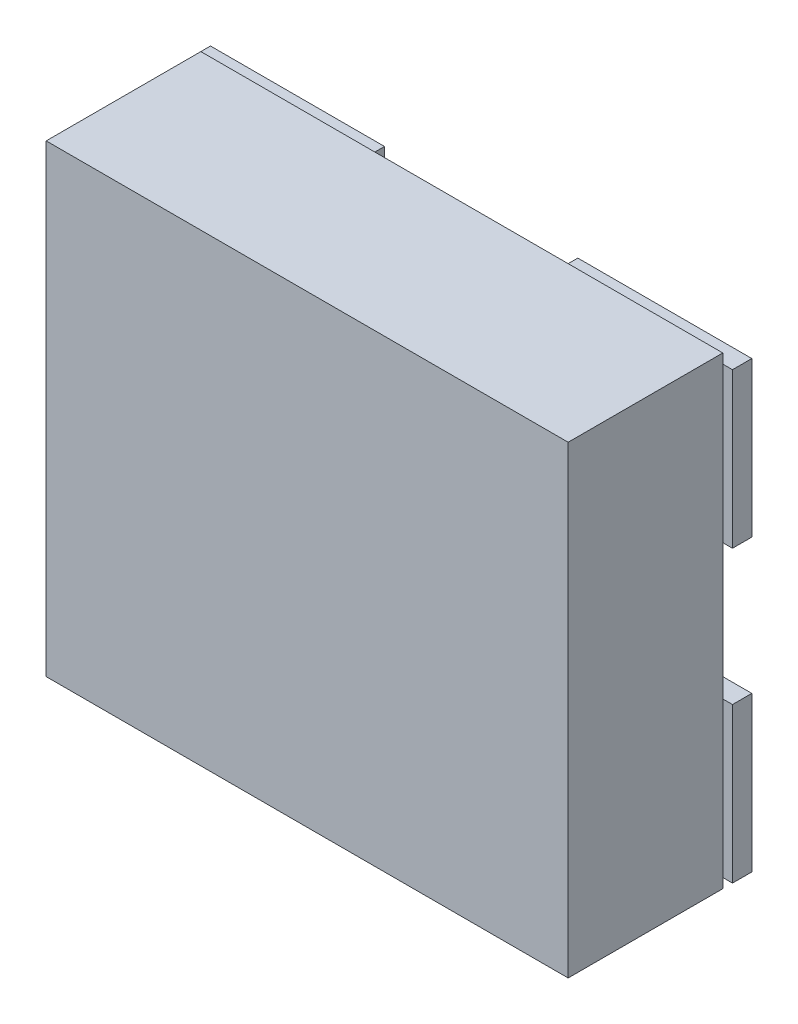
ISO-10303-21;
HEADER;
FILE_DESCRIPTION(('STEP AP214'),'2;1');
FILE_NAME('part.step','',(''),(''),'','','');
FILE_SCHEMA(('AUTOMOTIVE_DESIGN { 1 0 10303 214 1 1 1 1 }'));
ENDSEC;
DATA;
#1=APPLICATION_CONTEXT('core data for automotive mechanical design processes');
#2=APPLICATION_PROTOCOL_DEFINITION('international standard','automotive_design',2000,#1);
#3=PRODUCT_CONTEXT('',#1,'mechanical');
#4=PRODUCT('Part','Part','',(#3));
#5=PRODUCT_RELATED_PRODUCT_CATEGORY('part','',(#4));
#6=PRODUCT_DEFINITION_FORMATION('','',#4);
#7=PRODUCT_DEFINITION_CONTEXT('part definition',#1,'design');
#8=PRODUCT_DEFINITION('design','',#6,#7);
#9=PRODUCT_DEFINITION_SHAPE('','',#8);
#10=(LENGTH_UNIT() NAMED_UNIT(*) SI_UNIT(.MILLI.,.METRE.));
#11=(NAMED_UNIT(*) PLANE_ANGLE_UNIT() SI_UNIT($,.RADIAN.));
#12=(NAMED_UNIT(*) SI_UNIT($,.STERADIAN.) SOLID_ANGLE_UNIT());
#13=UNCERTAINTY_MEASURE_WITH_UNIT(LENGTH_MEASURE(1.E-05),#10,'distance_accuracy_value','');
#14=(GEOMETRIC_REPRESENTATION_CONTEXT(3) GLOBAL_UNCERTAINTY_ASSIGNED_CONTEXT((#13)) GLOBAL_UNIT_ASSIGNED_CONTEXT((#10,
#11,#12)) REPRESENTATION_CONTEXT('',''));
#15=CARTESIAN_POINT('',(0.,0.,0.));
#16=DIRECTION('',(0.,0.,1.));
#17=DIRECTION('',(1.,0.,0.));
#18=AXIS2_PLACEMENT_3D('',#15,#16,#17);
#19=CARTESIAN_POINT('',(0.,0.,0.9));
#20=DIRECTION('',(0.,0.,-1.));
#21=DIRECTION('',(0.,-1.,0.));
#22=AXIS2_PLACEMENT_3D('',#19,#20,#21);
#23=PLANE('',#22);
#24=DIRECTION('',(0.,1.,0.));
#25=VECTOR('',#24,1.);
#26=CARTESIAN_POINT('',(-1.35,-1.2,0.9));
#27=LINE('',#26,#25);
#28=CARTESIAN_POINT('',(-1.35,-1.2,0.9));
#29=VERTEX_POINT('',#28);
#30=CARTESIAN_POINT('',(-1.35,1.2,0.9));
#31=VERTEX_POINT('',#30);
#32=EDGE_CURVE('P0_E25',#29,#31,#27,.T.);
#33=ORIENTED_EDGE('',*,*,#32,.F.);
#34=DIRECTION('',(-1.,0.,0.));
#35=VECTOR('',#34,1.);
#36=CARTESIAN_POINT('',(1.35,-1.2,0.9));
#37=LINE('',#36,#35);
#38=CARTESIAN_POINT('',(1.35,-1.2,0.9));
#39=VERTEX_POINT('',#38);
#40=EDGE_CURVE('P0_E66',#39,#29,#37,.T.);
#41=ORIENTED_EDGE('',*,*,#40,.F.);
#42=DIRECTION('',(0.,-1.,0.));
#43=VECTOR('',#42,1.);
#44=CARTESIAN_POINT('',(1.35,1.2,0.9));
#45=LINE('',#44,#43);
#46=CARTESIAN_POINT('',(1.35,1.2,0.9));
#47=VERTEX_POINT('',#46);
#48=EDGE_CURVE('P0_E69',#47,#39,#45,.T.);
#49=ORIENTED_EDGE('',*,*,#48,.F.);
#50=DIRECTION('',(1.,0.,0.));
#51=VECTOR('',#50,1.);
#52=CARTESIAN_POINT('',(-1.35,1.2,0.9));
#53=LINE('',#52,#51);
#54=EDGE_CURVE('P0_E111',#31,#47,#53,.T.);
#55=ORIENTED_EDGE('',*,*,#54,.F.);
#56=EDGE_LOOP('',(#33,#41,#49,#55));
#57=FACE_BOUND('',#56,.T.);
#58=ADVANCED_FACE('P0_F17',(#57),#23,.F.);
#59=CARTESIAN_POINT('',(0.,0.,0.1));
#60=DIRECTION('',(0.,0.,-1.));
#61=DIRECTION('',(0.,-1.,0.));
#62=AXIS2_PLACEMENT_3D('',#59,#60,#61);
#63=PLANE('',#62);
#64=DIRECTION('',(1.,0.,0.));
#65=VECTOR('',#64,1.);
#66=CARTESIAN_POINT('',(-1.35,1.2,0.1));
#67=LINE('',#66,#65);
#68=CARTESIAN_POINT('',(-1.35,1.2,0.1));
#69=VERTEX_POINT('',#68);
#70=CARTESIAN_POINT('',(1.35,1.2,0.1));
#71=VERTEX_POINT('',#70);
#72=EDGE_CURVE('P0_E90',#69,#71,#67,.T.);
#73=ORIENTED_EDGE('',*,*,#72,.T.);
#74=DIRECTION('',(0.,-1.,0.));
#75=VECTOR('',#74,1.);
#76=CARTESIAN_POINT('',(1.35,1.2,0.1));
#77=LINE('',#76,#75);
#78=CARTESIAN_POINT('',(1.35,-1.2,0.1));
#79=VERTEX_POINT('',#78);
#80=EDGE_CURVE('P0_E75',#71,#79,#77,.T.);
#81=ORIENTED_EDGE('',*,*,#80,.T.);
#82=DIRECTION('',(-1.,0.,0.));
#83=VECTOR('',#82,1.);
#84=CARTESIAN_POINT('',(1.35,-1.2,0.1));
#85=LINE('',#84,#83);
#86=CARTESIAN_POINT('',(-1.35,-1.2,0.1));
#87=VERTEX_POINT('',#86);
#88=EDGE_CURVE('P0_E80',#79,#87,#85,.T.);
#89=ORIENTED_EDGE('',*,*,#88,.T.);
#90=DIRECTION('',(0.,1.,0.));
#91=VECTOR('',#90,1.);
#92=CARTESIAN_POINT('',(-1.35,-1.2,0.1));
#93=LINE('',#92,#91);
#94=EDGE_CURVE('P0_E11',#87,#69,#93,.T.);
#95=ORIENTED_EDGE('',*,*,#94,.T.);
#96=EDGE_LOOP('',(#73,#81,#89,#95));
#97=FACE_BOUND('',#96,.T.);
#98=ADVANCED_FACE('P0_F157',(#97),#63,.T.);
#99=CARTESIAN_POINT('',(-1.35,-1.2,0.1));
#100=DIRECTION('',(-1.,0.,0.));
#101=DIRECTION('',(0.,0.,1.));
#102=AXIS2_PLACEMENT_3D('',#99,#100,#101);
#103=PLANE('',#102);
#104=DIRECTION('',(0.,0.,1.));
#105=VECTOR('',#104,1.);
#106=CARTESIAN_POINT('',(-1.35,-1.2,0.1));
#107=LINE('',#106,#105);
#108=EDGE_CURVE('P0_E74',#87,#29,#107,.T.);
#109=ORIENTED_EDGE('',*,*,#108,.T.);
#110=ORIENTED_EDGE('',*,*,#32,.T.);
#111=DIRECTION('',(0.,0.,1.));
#112=VECTOR('',#111,1.);
#113=CARTESIAN_POINT('',(-1.35,1.2,0.1));
#114=LINE('',#113,#112);
#115=EDGE_CURVE('P0_E110',#69,#31,#114,.T.);
#116=ORIENTED_EDGE('',*,*,#115,.F.);
#117=ORIENTED_EDGE('',*,*,#94,.F.);
#118=EDGE_LOOP('',(#109,#110,#116,#117));
#119=FACE_BOUND('',#118,.T.);
#120=ADVANCED_FACE('P0_F108',(#119),#103,.T.);
#121=CARTESIAN_POINT('',(1.35,-1.2,0.1));
#122=DIRECTION('',(0.,-1.,0.));
#123=DIRECTION('',(0.,0.,-1.));
#124=AXIS2_PLACEMENT_3D('',#121,#122,#123);
#125=PLANE('',#124);
#126=DIRECTION('',(0.,0.,1.));
#127=VECTOR('',#126,1.);
#128=CARTESIAN_POINT('',(1.35,-1.2,0.1));
#129=LINE('',#128,#127);
#130=EDGE_CURVE('P0_E78',#79,#39,#129,.T.);
#131=ORIENTED_EDGE('',*,*,#130,.T.);
#132=ORIENTED_EDGE('',*,*,#40,.T.);
#133=ORIENTED_EDGE('',*,*,#108,.F.);
#134=ORIENTED_EDGE('',*,*,#88,.F.);
#135=EDGE_LOOP('',(#131,#132,#133,#134));
#136=FACE_BOUND('',#135,.T.);
#137=ADVANCED_FACE('P0_F79',(#136),#125,.T.);
#138=CARTESIAN_POINT('',(1.35,1.2,0.1));
#139=DIRECTION('',(1.,0.,0.));
#140=DIRECTION('',(0.,1.,0.));
#141=AXIS2_PLACEMENT_3D('',#138,#139,#140);
#142=PLANE('',#141);
#143=DIRECTION('',(0.,0.,1.));
#144=VECTOR('',#143,1.);
#145=CARTESIAN_POINT('',(1.35,1.2,0.1));
#146=LINE('',#145,#144);
#147=EDGE_CURVE('P0_E87',#71,#47,#146,.T.);
#148=ORIENTED_EDGE('',*,*,#147,.T.);
#149=ORIENTED_EDGE('',*,*,#48,.T.);
#150=ORIENTED_EDGE('',*,*,#130,.F.);
#151=ORIENTED_EDGE('',*,*,#80,.F.);
#152=EDGE_LOOP('',(#148,#149,#150,#151));
#153=FACE_BOUND('',#152,.T.);
#154=ADVANCED_FACE('P0_F85',(#153),#142,.T.);
#155=CARTESIAN_POINT('',(-1.35,1.2,0.1));
#156=DIRECTION('',(0.,1.,0.));
#157=DIRECTION('',(1.,0.,0.));
#158=AXIS2_PLACEMENT_3D('',#155,#156,#157);
#159=PLANE('',#158);
#160=ORIENTED_EDGE('',*,*,#115,.T.);
#161=ORIENTED_EDGE('',*,*,#54,.T.);
#162=ORIENTED_EDGE('',*,*,#147,.F.);
#163=ORIENTED_EDGE('',*,*,#72,.F.);
#164=EDGE_LOOP('',(#160,#161,#162,#163));
#165=FACE_BOUND('',#164,.T.);
#166=ADVANCED_FACE('P0_F116',(#165),#159,.T.);
#167=CLOSED_SHELL('',(#58,#98,#120,#137,#154,#166));
#168=MANIFOLD_SOLID_BREP('P0_B1',#167);
#169=CARTESIAN_POINT('',(-1.4,-1.15,0.1));
#170=DIRECTION('',(0.,0.,1.));
#171=DIRECTION('',(1.,0.,0.));
#172=AXIS2_PLACEMENT_3D('',#169,#170,#171);
#173=PLANE('',#172);
#174=DIRECTION('',(0.,1.,0.));
#175=VECTOR('',#174,1.);
#176=CARTESIAN_POINT('',(-1.4,-1.15,0.1));
#177=LINE('',#176,#175);
#178=CARTESIAN_POINT('',(-1.4,-1.15,0.1));
#179=VERTEX_POINT('',#178);
#180=CARTESIAN_POINT('',(-1.4,-0.35,0.1));
#181=VERTEX_POINT('',#180);
#182=EDGE_CURVE('P1_E87',#179,#181,#177,.T.);
#183=ORIENTED_EDGE('',*,*,#182,.F.);
#184=DIRECTION('',(1.,0.,0.));
#185=VECTOR('',#184,1.);
#186=CARTESIAN_POINT('',(-1.4,-1.15,0.1));
#187=LINE('',#186,#185);
#188=CARTESIAN_POINT('',(-0.5,-1.15,0.1));
#189=VERTEX_POINT('',#188);
#190=EDGE_CURVE('P1_E70',#179,#189,#187,.T.);
#191=ORIENTED_EDGE('',*,*,#190,.T.);
#192=DIRECTION('',(0.,1.,0.));
#193=VECTOR('',#192,1.);
#194=CARTESIAN_POINT('',(-0.5,-1.15,0.1));
#195=LINE('',#194,#193);
#196=CARTESIAN_POINT('',(-0.5,-0.35,0.1));
#197=VERTEX_POINT('',#196);
#198=EDGE_CURVE('P1_E82',#189,#197,#195,.T.);
#199=ORIENTED_EDGE('',*,*,#198,.T.);
#200=DIRECTION('',(1.,0.,0.));
#201=VECTOR('',#200,1.);
#202=CARTESIAN_POINT('',(-1.4,-0.35,0.1));
#203=LINE('',#202,#201);
#204=EDGE_CURVE('P1_E11',#181,#197,#203,.T.);
#205=ORIENTED_EDGE('',*,*,#204,.F.);
#206=EDGE_LOOP('',(#183,#191,#199,#205));
#207=FACE_BOUND('',#206,.T.);
#208=ADVANCED_FACE('P1_F17',(#207),#173,.T.);
#209=CARTESIAN_POINT('',(-1.4,-1.15,0.));
#210=DIRECTION('',(0.,0.,1.));
#211=DIRECTION('',(1.,0.,0.));
#212=AXIS2_PLACEMENT_3D('',#209,#210,#211);
#213=PLANE('',#212);
#214=DIRECTION('',(1.,0.,0.));
#215=VECTOR('',#214,1.);
#216=CARTESIAN_POINT('',(-1.4,-0.35,0.));
#217=LINE('',#216,#215);
#218=CARTESIAN_POINT('',(-1.4,-0.35,0.));
#219=VERTEX_POINT('',#218);
#220=CARTESIAN_POINT('',(-0.5,-0.35,0.));
#221=VERTEX_POINT('',#220);
#222=EDGE_CURVE('P1_E25',#219,#221,#217,.T.);
#223=ORIENTED_EDGE('',*,*,#222,.T.);
#224=DIRECTION('',(0.,1.,0.));
#225=VECTOR('',#224,1.);
#226=CARTESIAN_POINT('',(-0.5,-1.15,0.));
#227=LINE('',#226,#225);
#228=CARTESIAN_POINT('',(-0.5,-1.15,0.));
#229=VERTEX_POINT('',#228);
#230=EDGE_CURVE('P1_E104',#229,#221,#227,.T.);
#231=ORIENTED_EDGE('',*,*,#230,.F.);
#232=DIRECTION('',(1.,0.,0.));
#233=VECTOR('',#232,1.);
#234=CARTESIAN_POINT('',(-1.4,-1.15,0.));
#235=LINE('',#234,#233);
#236=CARTESIAN_POINT('',(-1.4,-1.15,0.));
#237=VERTEX_POINT('',#236);
#238=EDGE_CURVE('P1_E81',#237,#229,#235,.T.);
#239=ORIENTED_EDGE('',*,*,#238,.F.);
#240=DIRECTION('',(0.,1.,0.));
#241=VECTOR('',#240,1.);
#242=CARTESIAN_POINT('',(-1.4,-1.15,0.));
#243=LINE('',#242,#241);
#244=EDGE_CURVE('P1_E88',#237,#219,#243,.T.);
#245=ORIENTED_EDGE('',*,*,#244,.T.);
#246=EDGE_LOOP('',(#223,#231,#239,#245));
#247=FACE_BOUND('',#246,.T.);
#248=ADVANCED_FACE('P1_F119',(#247),#213,.F.);
#249=CARTESIAN_POINT('',(-1.4,-0.35,0.));
#250=DIRECTION('',(0.,1.,0.));
#251=DIRECTION('',(1.,0.,0.));
#252=AXIS2_PLACEMENT_3D('',#249,#250,#251);
#253=PLANE('',#252);
#254=ORIENTED_EDGE('',*,*,#222,.F.);
#255=DIRECTION('',(0.,0.,1.));
#256=VECTOR('',#255,1.);
#257=CARTESIAN_POINT('',(-1.4,-0.35,0.));
#258=LINE('',#257,#256);
#259=EDGE_CURVE('P1_E92',#219,#181,#258,.T.);
#260=ORIENTED_EDGE('',*,*,#259,.T.);
#261=ORIENTED_EDGE('',*,*,#204,.T.);
#262=DIRECTION('',(0.,0.,1.));
#263=VECTOR('',#262,1.);
#264=CARTESIAN_POINT('',(-0.5,-0.35,0.));
#265=LINE('',#264,#263);
#266=EDGE_CURVE('P1_E100',#221,#197,#265,.T.);
#267=ORIENTED_EDGE('',*,*,#266,.F.);
#268=EDGE_LOOP('',(#254,#260,#261,#267));
#269=FACE_BOUND('',#268,.T.);
#270=ADVANCED_FACE('P1_F118',(#269),#253,.T.);
#271=CARTESIAN_POINT('',(-1.4,-1.15,0.));
#272=DIRECTION('',(0.,1.,0.));
#273=DIRECTION('',(1.,0.,0.));
#274=AXIS2_PLACEMENT_3D('',#271,#272,#273);
#275=PLANE('',#274);
#276=DIRECTION('',(0.,0.,1.));
#277=VECTOR('',#276,1.);
#278=CARTESIAN_POINT('',(-0.5,-1.15,0.));
#279=LINE('',#278,#277);
#280=EDGE_CURVE('P1_E76',#229,#189,#279,.T.);
#281=ORIENTED_EDGE('',*,*,#280,.T.);
#282=ORIENTED_EDGE('',*,*,#190,.F.);
#283=DIRECTION('',(0.,0.,1.));
#284=VECTOR('',#283,1.);
#285=CARTESIAN_POINT('',(-1.4,-1.15,0.));
#286=LINE('',#285,#284);
#287=EDGE_CURVE('P1_E73',#237,#179,#286,.T.);
#288=ORIENTED_EDGE('',*,*,#287,.F.);
#289=ORIENTED_EDGE('',*,*,#238,.T.);
#290=EDGE_LOOP('',(#281,#282,#288,#289));
#291=FACE_BOUND('',#290,.T.);
#292=ADVANCED_FACE('P1_F72',(#291),#275,.F.);
#293=CARTESIAN_POINT('',(-0.5,-1.15,0.));
#294=DIRECTION('',(1.,0.,0.));
#295=DIRECTION('',(0.,1.,0.));
#296=AXIS2_PLACEMENT_3D('',#293,#294,#295);
#297=PLANE('',#296);
#298=ORIENTED_EDGE('',*,*,#280,.F.);
#299=ORIENTED_EDGE('',*,*,#230,.T.);
#300=ORIENTED_EDGE('',*,*,#266,.T.);
#301=ORIENTED_EDGE('',*,*,#198,.F.);
#302=EDGE_LOOP('',(#298,#299,#300,#301));
#303=FACE_BOUND('',#302,.T.);
#304=ADVANCED_FACE('P1_F117',(#303),#297,.T.);
#305=CARTESIAN_POINT('',(-1.4,-1.15,0.));
#306=DIRECTION('',(1.,0.,0.));
#307=DIRECTION('',(0.,1.,0.));
#308=AXIS2_PLACEMENT_3D('',#305,#306,#307);
#309=PLANE('',#308);
#310=ORIENTED_EDGE('',*,*,#182,.T.);
#311=ORIENTED_EDGE('',*,*,#259,.F.);
#312=ORIENTED_EDGE('',*,*,#244,.F.);
#313=ORIENTED_EDGE('',*,*,#287,.T.);
#314=EDGE_LOOP('',(#310,#311,#312,#313));
#315=FACE_BOUND('',#314,.T.);
#316=ADVANCED_FACE('P1_F85',(#315),#309,.F.);
#317=CLOSED_SHELL('',(#208,#248,#270,#292,#304,#316));
#318=MANIFOLD_SOLID_BREP('P1_B1',#317);
#319=CARTESIAN_POINT('',(0.5,-1.15,0.1));
#320=DIRECTION('',(0.,0.,1.));
#321=DIRECTION('',(1.,0.,0.));
#322=AXIS2_PLACEMENT_3D('',#319,#320,#321);
#323=PLANE('',#322);
#324=DIRECTION('',(0.,1.,0.));
#325=VECTOR('',#324,1.);
#326=CARTESIAN_POINT('',(0.5,-1.15,0.1));
#327=LINE('',#326,#325);
#328=CARTESIAN_POINT('',(0.5,-1.15,0.1));
#329=VERTEX_POINT('',#328);
#330=CARTESIAN_POINT('',(0.5,-0.35,0.1));
#331=VERTEX_POINT('',#330);
#332=EDGE_CURVE('P2_E114',#329,#331,#327,.T.);
#333=ORIENTED_EDGE('',*,*,#332,.F.);
#334=DIRECTION('',(1.,0.,0.));
#335=VECTOR('',#334,1.);
#336=CARTESIAN_POINT('',(0.5,-1.15,0.1));
#337=LINE('',#336,#335);
#338=CARTESIAN_POINT('',(1.4,-1.15,0.1));
#339=VERTEX_POINT('',#338);
#340=EDGE_CURVE('P2_E78',#329,#339,#337,.T.);
#341=ORIENTED_EDGE('',*,*,#340,.T.);
#342=DIRECTION('',(0.,1.,0.));
#343=VECTOR('',#342,1.);
#344=CARTESIAN_POINT('',(1.4,-1.15,0.1));
#345=LINE('',#344,#343);
#346=CARTESIAN_POINT('',(1.4,-0.35,0.1));
#347=VERTEX_POINT('',#346);
#348=EDGE_CURVE('P2_E89',#339,#347,#345,.T.);
#349=ORIENTED_EDGE('',*,*,#348,.T.);
#350=DIRECTION('',(1.,0.,0.));
#351=VECTOR('',#350,1.);
#352=CARTESIAN_POINT('',(0.5,-0.35,0.1));
#353=LINE('',#352,#351);
#354=EDGE_CURVE('P2_E11',#331,#347,#353,.T.);
#355=ORIENTED_EDGE('',*,*,#354,.F.);
#356=EDGE_LOOP('',(#333,#341,#349,#355));
#357=FACE_BOUND('',#356,.T.);
#358=ADVANCED_FACE('P2_F17',(#357),#323,.T.);
#359=CARTESIAN_POINT('',(0.5,-1.15,0.));
#360=DIRECTION('',(0.,0.,1.));
#361=DIRECTION('',(1.,0.,0.));
#362=AXIS2_PLACEMENT_3D('',#359,#360,#361);
#363=PLANE('',#362);
#364=DIRECTION('',(1.,0.,0.));
#365=VECTOR('',#364,1.);
#366=CARTESIAN_POINT('',(0.5,-0.35,0.));
#367=LINE('',#366,#365);
#368=CARTESIAN_POINT('',(0.5,-0.35,0.));
#369=VERTEX_POINT('',#368);
#370=CARTESIAN_POINT('',(1.4,-0.35,0.));
#371=VERTEX_POINT('',#370);
#372=EDGE_CURVE('P2_E25',#369,#371,#367,.T.);
#373=ORIENTED_EDGE('',*,*,#372,.T.);
#374=DIRECTION('',(0.,1.,0.));
#375=VECTOR('',#374,1.);
#376=CARTESIAN_POINT('',(1.4,-1.15,0.));
#377=LINE('',#376,#375);
#378=CARTESIAN_POINT('',(1.4,-1.15,0.));
#379=VERTEX_POINT('',#378);
#380=EDGE_CURVE('P2_E80',#379,#371,#377,.T.);
#381=ORIENTED_EDGE('',*,*,#380,.F.);
#382=DIRECTION('',(1.,0.,0.));
#383=VECTOR('',#382,1.);
#384=CARTESIAN_POINT('',(0.5,-1.15,0.));
#385=LINE('',#384,#383);
#386=CARTESIAN_POINT('',(0.5,-1.15,0.));
#387=VERTEX_POINT('',#386);
#388=EDGE_CURVE('P2_E70',#387,#379,#385,.T.);
#389=ORIENTED_EDGE('',*,*,#388,.F.);
#390=DIRECTION('',(0.,1.,0.));
#391=VECTOR('',#390,1.);
#392=CARTESIAN_POINT('',(0.5,-1.15,0.));
#393=LINE('',#392,#391);
#394=EDGE_CURVE('P2_E96',#387,#369,#393,.T.);
#395=ORIENTED_EDGE('',*,*,#394,.T.);
#396=EDGE_LOOP('',(#373,#381,#389,#395));
#397=FACE_BOUND('',#396,.T.);
#398=ADVANCED_FACE('P2_F81',(#397),#363,.F.);
#399=CARTESIAN_POINT('',(0.5,-0.35,0.));
#400=DIRECTION('',(0.,1.,0.));
#401=DIRECTION('',(1.,0.,0.));
#402=AXIS2_PLACEMENT_3D('',#399,#400,#401);
#403=PLANE('',#402);
#404=ORIENTED_EDGE('',*,*,#372,.F.);
#405=DIRECTION('',(0.,0.,1.));
#406=VECTOR('',#405,1.);
#407=CARTESIAN_POINT('',(0.5,-0.35,0.));
#408=LINE('',#407,#406);
#409=EDGE_CURVE('P2_E100',#369,#331,#408,.T.);
#410=ORIENTED_EDGE('',*,*,#409,.T.);
#411=ORIENTED_EDGE('',*,*,#354,.T.);
#412=DIRECTION('',(0.,0.,1.));
#413=VECTOR('',#412,1.);
#414=CARTESIAN_POINT('',(1.4,-0.35,0.));
#415=LINE('',#414,#413);
#416=EDGE_CURVE('P2_E85',#371,#347,#415,.T.);
#417=ORIENTED_EDGE('',*,*,#416,.F.);
#418=EDGE_LOOP('',(#404,#410,#411,#417));
#419=FACE_BOUND('',#418,.T.);
#420=ADVANCED_FACE('P2_F124',(#419),#403,.T.);
#421=CARTESIAN_POINT('',(0.5,-1.15,0.));
#422=DIRECTION('',(0.,1.,0.));
#423=DIRECTION('',(1.,0.,0.));
#424=AXIS2_PLACEMENT_3D('',#421,#422,#423);
#425=PLANE('',#424);
#426=DIRECTION('',(0.,0.,1.));
#427=VECTOR('',#426,1.);
#428=CARTESIAN_POINT('',(1.4,-1.15,0.));
#429=LINE('',#428,#427);
#430=EDGE_CURVE('P2_E73',#379,#339,#429,.T.);
#431=ORIENTED_EDGE('',*,*,#430,.T.);
#432=ORIENTED_EDGE('',*,*,#340,.F.);
#433=DIRECTION('',(0.,0.,1.));
#434=VECTOR('',#433,1.);
#435=CARTESIAN_POINT('',(0.5,-1.15,0.));
#436=LINE('',#435,#434);
#437=EDGE_CURVE('P2_E75',#387,#329,#436,.T.);
#438=ORIENTED_EDGE('',*,*,#437,.F.);
#439=ORIENTED_EDGE('',*,*,#388,.T.);
#440=EDGE_LOOP('',(#431,#432,#438,#439));
#441=FACE_BOUND('',#440,.T.);
#442=ADVANCED_FACE('P2_F71',(#441),#425,.F.);
#443=CARTESIAN_POINT('',(1.4,-1.15,0.));
#444=DIRECTION('',(1.,0.,0.));
#445=DIRECTION('',(0.,1.,0.));
#446=AXIS2_PLACEMENT_3D('',#443,#444,#445);
#447=PLANE('',#446);
#448=ORIENTED_EDGE('',*,*,#430,.F.);
#449=ORIENTED_EDGE('',*,*,#380,.T.);
#450=ORIENTED_EDGE('',*,*,#416,.T.);
#451=ORIENTED_EDGE('',*,*,#348,.F.);
#452=EDGE_LOOP('',(#448,#449,#450,#451));
#453=FACE_BOUND('',#452,.T.);
#454=ADVANCED_FACE('P2_F88',(#453),#447,.T.);
#455=CARTESIAN_POINT('',(0.5,-1.15,0.));
#456=DIRECTION('',(1.,0.,0.));
#457=DIRECTION('',(0.,1.,0.));
#458=AXIS2_PLACEMENT_3D('',#455,#456,#457);
#459=PLANE('',#458);
#460=ORIENTED_EDGE('',*,*,#332,.T.);
#461=ORIENTED_EDGE('',*,*,#409,.F.);
#462=ORIENTED_EDGE('',*,*,#394,.F.);
#463=ORIENTED_EDGE('',*,*,#437,.T.);
#464=EDGE_LOOP('',(#460,#461,#462,#463));
#465=FACE_BOUND('',#464,.T.);
#466=ADVANCED_FACE('P2_F116',(#465),#459,.F.);
#467=CLOSED_SHELL('',(#358,#398,#420,#442,#454,#466));
#468=MANIFOLD_SOLID_BREP('P2_B1',#467);
#469=CARTESIAN_POINT('',(0.5,0.35,0.1));
#470=DIRECTION('',(0.,0.,1.));
#471=DIRECTION('',(1.,0.,0.));
#472=AXIS2_PLACEMENT_3D('',#469,#470,#471);
#473=PLANE('',#472);
#474=DIRECTION('',(0.,1.,0.));
#475=VECTOR('',#474,1.);
#476=CARTESIAN_POINT('',(0.5,0.35,0.1));
#477=LINE('',#476,#475);
#478=CARTESIAN_POINT('',(0.5,0.35,0.1));
#479=VERTEX_POINT('',#478);
#480=CARTESIAN_POINT('',(0.5,1.15,0.1));
#481=VERTEX_POINT('',#480);
#482=EDGE_CURVE('P3_E68',#479,#481,#477,.T.);
#483=ORIENTED_EDGE('',*,*,#482,.F.);
#484=DIRECTION('',(1.,0.,0.));
#485=VECTOR('',#484,1.);
#486=CARTESIAN_POINT('',(0.5,0.35,0.1));
#487=LINE('',#486,#485);
#488=CARTESIAN_POINT('',(1.4,0.35,0.1));
#489=VERTEX_POINT('',#488);
#490=EDGE_CURVE('P3_E63',#479,#489,#487,.T.);
#491=ORIENTED_EDGE('',*,*,#490,.T.);
#492=DIRECTION('',(0.,1.,0.));
#493=VECTOR('',#492,1.);
#494=CARTESIAN_POINT('',(1.4,0.35,0.1));
#495=LINE('',#494,#493);
#496=CARTESIAN_POINT('',(1.4,1.15,0.1));
#497=VERTEX_POINT('',#496);
#498=EDGE_CURVE('P3_E65',#489,#497,#495,.T.);
#499=ORIENTED_EDGE('',*,*,#498,.T.);
#500=DIRECTION('',(1.,0.,0.));
#501=VECTOR('',#500,1.);
#502=CARTESIAN_POINT('',(0.5,1.15,0.1));
#503=LINE('',#502,#501);
#504=EDGE_CURVE('P3_E11',#481,#497,#503,.T.);
#505=ORIENTED_EDGE('',*,*,#504,.F.);
#506=EDGE_LOOP('',(#483,#491,#499,#505));
#507=FACE_BOUND('',#506,.T.);
#508=ADVANCED_FACE('P3_F17',(#507),#473,.T.);
#509=CARTESIAN_POINT('',(0.5,0.35,0.));
#510=DIRECTION('',(0.,0.,1.));
#511=DIRECTION('',(1.,0.,0.));
#512=AXIS2_PLACEMENT_3D('',#509,#510,#511);
#513=PLANE('',#512);
#514=DIRECTION('',(1.,0.,0.));
#515=VECTOR('',#514,1.);
#516=CARTESIAN_POINT('',(0.5,1.15,0.));
#517=LINE('',#516,#515);
#518=CARTESIAN_POINT('',(0.5,1.15,0.));
#519=VERTEX_POINT('',#518);
#520=CARTESIAN_POINT('',(1.4,1.15,0.));
#521=VERTEX_POINT('',#520);
#522=EDGE_CURVE('P3_E26',#519,#521,#517,.T.);
#523=ORIENTED_EDGE('',*,*,#522,.T.);
#524=DIRECTION('',(0.,1.,0.));
#525=VECTOR('',#524,1.);
#526=CARTESIAN_POINT('',(1.4,0.35,0.));
#527=LINE('',#526,#525);
#528=CARTESIAN_POINT('',(1.4,0.35,0.));
#529=VERTEX_POINT('',#528);
#530=EDGE_CURVE('P3_E86',#529,#521,#527,.T.);
#531=ORIENTED_EDGE('',*,*,#530,.F.);
#532=DIRECTION('',(1.,0.,0.));
#533=VECTOR('',#532,1.);
#534=CARTESIAN_POINT('',(0.5,0.35,0.));
#535=LINE('',#534,#533);
#536=CARTESIAN_POINT('',(0.5,0.35,0.));
#537=VERTEX_POINT('',#536);
#538=EDGE_CURVE('P3_E74',#537,#529,#535,.T.);
#539=ORIENTED_EDGE('',*,*,#538,.F.);
#540=DIRECTION('',(0.,1.,0.));
#541=VECTOR('',#540,1.);
#542=CARTESIAN_POINT('',(0.5,0.35,0.));
#543=LINE('',#542,#541);
#544=EDGE_CURVE('P3_E94',#537,#519,#543,.T.);
#545=ORIENTED_EDGE('',*,*,#544,.T.);
#546=EDGE_LOOP('',(#523,#531,#539,#545));
#547=FACE_BOUND('',#546,.T.);
#548=ADVANCED_FACE('P3_F133',(#547),#513,.F.);
#549=CARTESIAN_POINT('',(0.5,1.15,0.));
#550=DIRECTION('',(0.,1.,0.));
#551=DIRECTION('',(1.,0.,0.));
#552=AXIS2_PLACEMENT_3D('',#549,#550,#551);
#553=PLANE('',#552);
#554=ORIENTED_EDGE('',*,*,#522,.F.);
#555=DIRECTION('',(0.,0.,1.));
#556=VECTOR('',#555,1.);
#557=CARTESIAN_POINT('',(0.5,1.15,0.));
#558=LINE('',#557,#556);
#559=EDGE_CURVE('P3_E174',#519,#481,#558,.T.);
#560=ORIENTED_EDGE('',*,*,#559,.T.);
#561=ORIENTED_EDGE('',*,*,#504,.T.);
#562=DIRECTION('',(0.,0.,1.));
#563=VECTOR('',#562,1.);
#564=CARTESIAN_POINT('',(1.4,1.15,0.));
#565=LINE('',#564,#563);
#566=EDGE_CURVE('P3_E80',#521,#497,#565,.T.);
#567=ORIENTED_EDGE('',*,*,#566,.F.);
#568=EDGE_LOOP('',(#554,#560,#561,#567));
#569=FACE_BOUND('',#568,.T.);
#570=ADVANCED_FACE('P3_F126',(#569),#553,.T.);
#571=CARTESIAN_POINT('',(0.5,0.35,0.));
#572=DIRECTION('',(0.,1.,0.));
#573=DIRECTION('',(1.,0.,0.));
#574=AXIS2_PLACEMENT_3D('',#571,#572,#573);
#575=PLANE('',#574);
#576=DIRECTION('',(0.,0.,1.));
#577=VECTOR('',#576,1.);
#578=CARTESIAN_POINT('',(1.4,0.35,0.));
#579=LINE('',#578,#577);
#580=EDGE_CURVE('P3_E79',#529,#489,#579,.T.);
#581=ORIENTED_EDGE('',*,*,#580,.T.);
#582=ORIENTED_EDGE('',*,*,#490,.F.);
#583=DIRECTION('',(0.,0.,1.));
#584=VECTOR('',#583,1.);
#585=CARTESIAN_POINT('',(0.5,0.35,0.));
#586=LINE('',#585,#584);
#587=EDGE_CURVE('P3_E87',#537,#479,#586,.T.);
#588=ORIENTED_EDGE('',*,*,#587,.F.);
#589=ORIENTED_EDGE('',*,*,#538,.T.);
#590=EDGE_LOOP('',(#581,#582,#588,#589));
#591=FACE_BOUND('',#590,.T.);
#592=ADVANCED_FACE('P3_F83',(#591),#575,.F.);
#593=CARTESIAN_POINT('',(1.4,0.35,0.));
#594=DIRECTION('',(1.,0.,0.));
#595=DIRECTION('',(0.,1.,0.));
#596=AXIS2_PLACEMENT_3D('',#593,#594,#595);
#597=PLANE('',#596);
#598=ORIENTED_EDGE('',*,*,#580,.F.);
#599=ORIENTED_EDGE('',*,*,#530,.T.);
#600=ORIENTED_EDGE('',*,*,#566,.T.);
#601=ORIENTED_EDGE('',*,*,#498,.F.);
#602=EDGE_LOOP('',(#598,#599,#600,#601));
#603=FACE_BOUND('',#602,.T.);
#604=ADVANCED_FACE('P3_F77',(#603),#597,.T.);
#605=CARTESIAN_POINT('',(0.5,0.35,0.));
#606=DIRECTION('',(1.,0.,0.));
#607=DIRECTION('',(0.,1.,0.));
#608=AXIS2_PLACEMENT_3D('',#605,#606,#607);
#609=PLANE('',#608);
#610=ORIENTED_EDGE('',*,*,#482,.T.);
#611=ORIENTED_EDGE('',*,*,#559,.F.);
#612=ORIENTED_EDGE('',*,*,#544,.F.);
#613=ORIENTED_EDGE('',*,*,#587,.T.);
#614=EDGE_LOOP('',(#610,#611,#612,#613));
#615=FACE_BOUND('',#614,.T.);
#616=ADVANCED_FACE('P3_F107',(#615),#609,.F.);
#617=CLOSED_SHELL('',(#508,#548,#570,#592,#604,#616));
#618=MANIFOLD_SOLID_BREP('P3_B1',#617);
#619=CARTESIAN_POINT('',(-1.4,0.35,0.1));
#620=DIRECTION('',(0.,0.,1.));
#621=DIRECTION('',(1.,0.,0.));
#622=AXIS2_PLACEMENT_3D('',#619,#620,#621);
#623=PLANE('',#622);
#624=DIRECTION('',(0.,1.,0.));
#625=VECTOR('',#624,1.);
#626=CARTESIAN_POINT('',(-1.4,0.35,0.1));
#627=LINE('',#626,#625);
#628=CARTESIAN_POINT('',(-1.4,0.35,0.1));
#629=VERTEX_POINT('',#628);
#630=CARTESIAN_POINT('',(-1.4,1.15,0.1));
#631=VERTEX_POINT('',#630);
#632=EDGE_CURVE('P4_E88',#629,#631,#627,.T.);
#633=ORIENTED_EDGE('',*,*,#632,.F.);
#634=DIRECTION('',(1.,0.,0.));
#635=VECTOR('',#634,1.);
#636=CARTESIAN_POINT('',(-1.4,0.35,0.1));
#637=LINE('',#636,#635);
#638=CARTESIAN_POINT('',(-0.5,0.35,0.1));
#639=VERTEX_POINT('',#638);
#640=EDGE_CURVE('P4_E70',#629,#639,#637,.T.);
#641=ORIENTED_EDGE('',*,*,#640,.T.);
#642=DIRECTION('',(0.,1.,0.));
#643=VECTOR('',#642,1.);
#644=CARTESIAN_POINT('',(-0.5,0.35,0.1));
#645=LINE('',#644,#643);
#646=CARTESIAN_POINT('',(-0.5,1.15,0.1));
#647=VERTEX_POINT('',#646);
#648=EDGE_CURVE('P4_E82',#639,#647,#645,.T.);
#649=ORIENTED_EDGE('',*,*,#648,.T.);
#650=DIRECTION('',(1.,0.,0.));
#651=VECTOR('',#650,1.);
#652=CARTESIAN_POINT('',(-1.4,1.15,0.1));
#653=LINE('',#652,#651);
#654=EDGE_CURVE('P4_E11',#631,#647,#653,.T.);
#655=ORIENTED_EDGE('',*,*,#654,.F.);
#656=EDGE_LOOP('',(#633,#641,#649,#655));
#657=FACE_BOUND('',#656,.T.);
#658=ADVANCED_FACE('P4_F17',(#657),#623,.T.);
#659=CARTESIAN_POINT('',(-1.4,0.35,0.));
#660=DIRECTION('',(0.,0.,1.));
#661=DIRECTION('',(1.,0.,0.));
#662=AXIS2_PLACEMENT_3D('',#659,#660,#661);
#663=PLANE('',#662);
#664=DIRECTION('',(1.,0.,0.));
#665=VECTOR('',#664,1.);
#666=CARTESIAN_POINT('',(-1.4,1.15,0.));
#667=LINE('',#666,#665);
#668=CARTESIAN_POINT('',(-1.4,1.15,0.));
#669=VERTEX_POINT('',#668);
#670=CARTESIAN_POINT('',(-0.5,1.15,0.));
#671=VERTEX_POINT('',#670);
#672=EDGE_CURVE('P4_E25',#669,#671,#667,.T.);
#673=ORIENTED_EDGE('',*,*,#672,.T.);
#674=DIRECTION('',(0.,1.,0.));
#675=VECTOR('',#674,1.);
#676=CARTESIAN_POINT('',(-0.5,0.35,0.));
#677=LINE('',#676,#675);
#678=CARTESIAN_POINT('',(-0.5,0.35,0.));
#679=VERTEX_POINT('',#678);
#680=EDGE_CURVE('P4_E99',#679,#671,#677,.T.);
#681=ORIENTED_EDGE('',*,*,#680,.F.);
#682=DIRECTION('',(1.,0.,0.));
#683=VECTOR('',#682,1.);
#684=CARTESIAN_POINT('',(-1.4,0.35,0.));
#685=LINE('',#684,#683);
#686=CARTESIAN_POINT('',(-1.4,0.35,0.));
#687=VERTEX_POINT('',#686);
#688=EDGE_CURVE('P4_E81',#687,#679,#685,.T.);
#689=ORIENTED_EDGE('',*,*,#688,.F.);
#690=DIRECTION('',(0.,1.,0.));
#691=VECTOR('',#690,1.);
#692=CARTESIAN_POINT('',(-1.4,0.35,0.));
#693=LINE('',#692,#691);
#694=EDGE_CURVE('P4_E89',#687,#669,#693,.T.);
#695=ORIENTED_EDGE('',*,*,#694,.T.);
#696=EDGE_LOOP('',(#673,#681,#689,#695));
#697=FACE_BOUND('',#696,.T.);
#698=ADVANCED_FACE('P4_F141',(#697),#663,.F.);
#699=CARTESIAN_POINT('',(-1.4,1.15,0.));
#700=DIRECTION('',(0.,1.,0.));
#701=DIRECTION('',(1.,0.,0.));
#702=AXIS2_PLACEMENT_3D('',#699,#700,#701);
#703=PLANE('',#702);
#704=ORIENTED_EDGE('',*,*,#672,.F.);
#705=DIRECTION('',(0.,0.,1.));
#706=VECTOR('',#705,1.);
#707=CARTESIAN_POINT('',(-1.4,1.15,0.));
#708=LINE('',#707,#706);
#709=EDGE_CURVE('P4_E93',#669,#631,#708,.T.);
#710=ORIENTED_EDGE('',*,*,#709,.T.);
#711=ORIENTED_EDGE('',*,*,#654,.T.);
#712=DIRECTION('',(0.,0.,1.));
#713=VECTOR('',#712,1.);
#714=CARTESIAN_POINT('',(-0.5,1.15,0.));
#715=LINE('',#714,#713);
#716=EDGE_CURVE('P4_E103',#671,#647,#715,.T.);
#717=ORIENTED_EDGE('',*,*,#716,.F.);
#718=EDGE_LOOP('',(#704,#710,#711,#717));
#719=FACE_BOUND('',#718,.T.);
#720=ADVANCED_FACE('P4_F137',(#719),#703,.T.);
#721=CARTESIAN_POINT('',(-1.4,0.35,0.));
#722=DIRECTION('',(0.,1.,0.));
#723=DIRECTION('',(1.,0.,0.));
#724=AXIS2_PLACEMENT_3D('',#721,#722,#723);
#725=PLANE('',#724);
#726=DIRECTION('',(0.,0.,1.));
#727=VECTOR('',#726,1.);
#728=CARTESIAN_POINT('',(-0.5,0.35,0.));
#729=LINE('',#728,#727);
#730=EDGE_CURVE('P4_E76',#679,#639,#729,.T.);
#731=ORIENTED_EDGE('',*,*,#730,.T.);
#732=ORIENTED_EDGE('',*,*,#640,.F.);
#733=DIRECTION('',(0.,0.,1.));
#734=VECTOR('',#733,1.);
#735=CARTESIAN_POINT('',(-1.4,0.35,0.));
#736=LINE('',#735,#734);
#737=EDGE_CURVE('P4_E73',#687,#629,#736,.T.);
#738=ORIENTED_EDGE('',*,*,#737,.F.);
#739=ORIENTED_EDGE('',*,*,#688,.T.);
#740=EDGE_LOOP('',(#731,#732,#738,#739));
#741=FACE_BOUND('',#740,.T.);
#742=ADVANCED_FACE('P4_F72',(#741),#725,.F.);
#743=CARTESIAN_POINT('',(-0.5,0.35,0.));
#744=DIRECTION('',(1.,0.,0.));
#745=DIRECTION('',(0.,1.,0.));
#746=AXIS2_PLACEMENT_3D('',#743,#744,#745);
#747=PLANE('',#746);
#748=ORIENTED_EDGE('',*,*,#730,.F.);
#749=ORIENTED_EDGE('',*,*,#680,.T.);
#750=ORIENTED_EDGE('',*,*,#716,.T.);
#751=ORIENTED_EDGE('',*,*,#648,.F.);
#752=EDGE_LOOP('',(#748,#749,#750,#751));
#753=FACE_BOUND('',#752,.T.);
#754=ADVANCED_FACE('P4_F125',(#753),#747,.T.);
#755=CARTESIAN_POINT('',(-1.4,0.35,0.));
#756=DIRECTION('',(1.,0.,0.));
#757=DIRECTION('',(0.,1.,0.));
#758=AXIS2_PLACEMENT_3D('',#755,#756,#757);
#759=PLANE('',#758);
#760=ORIENTED_EDGE('',*,*,#632,.T.);
#761=ORIENTED_EDGE('',*,*,#709,.F.);
#762=ORIENTED_EDGE('',*,*,#694,.F.);
#763=ORIENTED_EDGE('',*,*,#737,.T.);
#764=EDGE_LOOP('',(#760,#761,#762,#763));
#765=FACE_BOUND('',#764,.T.);
#766=ADVANCED_FACE('P4_F86',(#765),#759,.F.);
#767=CLOSED_SHELL('',(#658,#698,#720,#742,#754,#766));
#768=MANIFOLD_SOLID_BREP('P4_B1',#767);
#769=ADVANCED_BREP_SHAPE_REPRESENTATION('',(#18,#168,#318,#468,#618,#768),#14);
#770=SHAPE_DEFINITION_REPRESENTATION(#9,#769);
ENDSEC;
END-ISO-10303-21;
